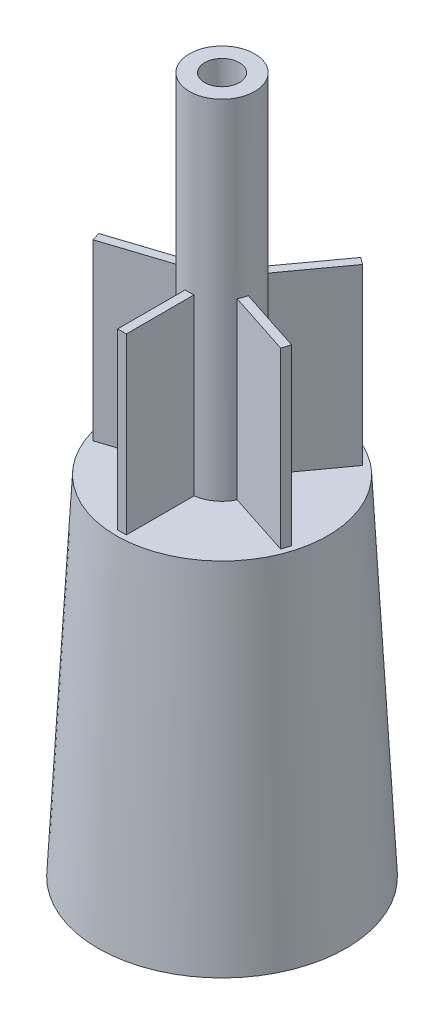
ISO-10303-21;
HEADER;
FILE_DESCRIPTION(('STEP AP214'),'2;1');
FILE_NAME('part.step','',(''),(''),'','','');
FILE_SCHEMA(('AUTOMOTIVE_DESIGN { 1 0 10303 214 1 1 1 1 }'));
ENDSEC;
DATA;
#1=APPLICATION_CONTEXT('core data for automotive mechanical design processes');
#2=APPLICATION_PROTOCOL_DEFINITION('international standard','automotive_design',2000,#1);
#3=PRODUCT_CONTEXT('',#1,'mechanical');
#4=PRODUCT('Part','Part','',(#3));
#5=PRODUCT_RELATED_PRODUCT_CATEGORY('part','',(#4));
#6=PRODUCT_DEFINITION_FORMATION('','',#4);
#7=PRODUCT_DEFINITION_CONTEXT('part definition',#1,'design');
#8=PRODUCT_DEFINITION('design','',#6,#7);
#9=PRODUCT_DEFINITION_SHAPE('','',#8);
#10=(LENGTH_UNIT() NAMED_UNIT(*) SI_UNIT(.MILLI.,.METRE.));
#11=(NAMED_UNIT(*) PLANE_ANGLE_UNIT() SI_UNIT($,.RADIAN.));
#12=(NAMED_UNIT(*) SI_UNIT($,.STERADIAN.) SOLID_ANGLE_UNIT());
#13=UNCERTAINTY_MEASURE_WITH_UNIT(LENGTH_MEASURE(1.E-05),#10,'distance_accuracy_value','');
#14=(GEOMETRIC_REPRESENTATION_CONTEXT(3) GLOBAL_UNCERTAINTY_ASSIGNED_CONTEXT((#13)) GLOBAL_UNIT_ASSIGNED_CONTEXT((#10,
#11,#12)) REPRESENTATION_CONTEXT('',''));
#15=CARTESIAN_POINT('',(0.,0.,0.));
#16=DIRECTION('',(0.,0.,1.));
#17=DIRECTION('',(1.,0.,0.));
#18=AXIS2_PLACEMENT_3D('',#15,#16,#17);
#19=CARTESIAN_POINT('',(0.,8.,0.));
#20=DIRECTION('',(0.,1.,0.));
#21=DIRECTION('',(0.,0.,1.));
#22=AXIS2_PLACEMENT_3D('',#19,#20,#21);
#23=PLANE('',#22);
#24=CARTESIAN_POINT('',(0.,8.,0.));
#25=DIRECTION('',(0.,1.,0.));
#26=DIRECTION('',(0.,0.,1.));
#27=AXIS2_PLACEMENT_3D('',#24,#25,#26);
#28=CIRCLE('',#27,2.43073776573567);
#29=CARTESIAN_POINT('',(0.,8.,2.43073776573567));
#30=VERTEX_POINT('',#29);
#31=EDGE_CURVE('E291',#30,#30,#28,.T.);
#32=ORIENTED_EDGE('',*,*,#31,.T.);
#33=EDGE_LOOP('',(#32));
#34=FACE_BOUND('',#33,.T.);
#35=CARTESIAN_POINT('',(0.,8.,0.));
#36=DIRECTION('',(0.,1.,0.));
#37=DIRECTION('',(0.,0.,1.));
#38=AXIS2_PLACEMENT_3D('',#35,#36,#37);
#39=CIRCLE('',#38,0.75);
#40=CARTESIAN_POINT('',(0.737397925678106,8.,0.13690982143596));
#41=VERTEX_POINT('',#40);
#42=CARTESIAN_POINT('',(0.518859513444568,8.,-0.541557758053623));
#43=VERTEX_POINT('',#42);
#44=EDGE_CURVE('E191',#41,#43,#39,.T.);
#45=ORIENTED_EDGE('',*,*,#44,.F.);
#46=DIRECTION('',(-0.951056516295151,0.,-0.309016994374954));
#47=VECTOR('',#46,1.);
#48=CARTESIAN_POINT('',(0.726953200234936,8.,0.133516124417729));
#49=LINE('',#48,#47);
#50=CARTESIAN_POINT('',(2.21599119974614,8.,0.617333898898175));
#51=VERTEX_POINT('',#50);
#52=EDGE_CURVE('E173',#51,#41,#49,.T.);
#53=ORIENTED_EDGE('',*,*,#52,.F.);
#54=DIRECTION('',(0.309016994374956,0.,-0.951056516295151));
#55=VECTOR('',#54,1.);
#56=CARTESIAN_POINT('',(2.21599119974614,8.,0.617333898898175));
#57=LINE('',#56,#55);
#58=CARTESIAN_POINT('',(2.15418780087115,8.,0.807545202157205));
#59=VERTEX_POINT('',#58);
#60=EDGE_CURVE('E182',#59,#51,#57,.T.);
#61=ORIENTED_EDGE('',*,*,#60,.F.);
#62=DIRECTION('',(0.951056516295151,0.,0.309016994374954));
#63=VECTOR('',#62,1.);
#64=CARTESIAN_POINT('',(0.664541881958577,8.,0.323529902689533));
#65=LINE('',#64,#63);
#66=CARTESIAN_POINT('',(0.674995593259396,8.,0.326926519389901));
#67=VERTEX_POINT('',#66);
#68=EDGE_CURVE('E192',#67,#59,#65,.T.);
#69=ORIENTED_EDGE('',*,*,#68,.F.);
#70=CARTESIAN_POINT('',(0.1,8.,0.743303437365925));
#71=VERTEX_POINT('',#70);
#72=EDGE_CURVE('E279',#71,#67,#39,.T.);
#73=ORIENTED_EDGE('',*,*,#72,.F.);
#74=DIRECTION('',(0.,0.,-1.));
#75=VECTOR('',#74,1.);
#76=CARTESIAN_POINT('',(0.1,8.,0.732316537305661));
#77=LINE('',#76,#75);
#78=CARTESIAN_POINT('',(0.1,8.,2.3));
#79=VERTEX_POINT('',#78);
#80=EDGE_CURVE('E242',#79,#71,#77,.T.);
#81=ORIENTED_EDGE('',*,*,#80,.F.);
#82=DIRECTION('',(1.,0.,0.));
#83=VECTOR('',#82,1.);
#84=CARTESIAN_POINT('',(0.1,8.,2.3));
#85=LINE('',#84,#83);
#86=CARTESIAN_POINT('',(-0.1,8.,2.3));
#87=VERTEX_POINT('',#86);
#88=EDGE_CURVE('E240',#87,#79,#85,.T.);
#89=ORIENTED_EDGE('',*,*,#88,.F.);
#90=DIRECTION('',(0.,0.,1.));
#91=VECTOR('',#90,1.);
#92=CARTESIAN_POINT('',(-0.1,8.,0.732316537305661));
#93=LINE('',#92,#91);
#94=CARTESIAN_POINT('',(-0.1,8.,0.743303437365925));
#95=VERTEX_POINT('',#94);
#96=EDGE_CURVE('E238',#95,#87,#93,.T.);
#97=ORIENTED_EDGE('',*,*,#96,.F.);
#98=CARTESIAN_POINT('',(-0.674995593259361,8.,0.326926519389975));
#99=VERTEX_POINT('',#98);
#100=EDGE_CURVE('E275',#99,#95,#39,.T.);
#101=ORIENTED_EDGE('',*,*,#100,.F.);
#102=DIRECTION('',(0.951056516295152,0.,-0.309016994374952));
#103=VECTOR('',#102,1.);
#104=CARTESIAN_POINT('',(-0.664541881958541,8.,0.323529902689606));
#105=LINE('',#104,#103);
#106=CARTESIAN_POINT('',(-2.15418780087127,8.,0.807545202157327));
#107=VERTEX_POINT('',#106);
#108=EDGE_CURVE('E260',#107,#99,#105,.T.);
#109=ORIENTED_EDGE('',*,*,#108,.F.);
#110=DIRECTION('',(0.309016994374943,0.,0.951056516295155));
#111=VECTOR('',#110,1.);
#112=CARTESIAN_POINT('',(-2.15418780087127,8.,0.807545202157327));
#113=LINE('',#112,#111);
#114=CARTESIAN_POINT('',(-2.21599119974626,8.,0.617333898898296));
#115=VERTEX_POINT('',#114);
#116=EDGE_CURVE('E258',#115,#107,#113,.T.);
#117=ORIENTED_EDGE('',*,*,#116,.F.);
#118=DIRECTION('',(-0.951056516295152,0.,0.309016994374952));
#119=VECTOR('',#118,1.);
#120=CARTESIAN_POINT('',(-0.726953200234921,8.,0.133516124417809));
#121=LINE('',#120,#119);
#122=CARTESIAN_POINT('',(-0.737397925678091,8.,0.13690982143604));
#123=VERTEX_POINT('',#122);
#124=EDGE_CURVE('E256',#123,#115,#121,.T.);
#125=ORIENTED_EDGE('',*,*,#124,.F.);
#126=CARTESIAN_POINT('',(-0.518859513444723,8.,-0.541557758053474));
#127=VERTEX_POINT('',#126);
#128=EDGE_CURVE('E274',#127,#123,#39,.T.);
#129=ORIENTED_EDGE('',*,*,#128,.F.);
#130=DIRECTION('',(0.587785252292486,0.,0.809016994374938));
#131=VECTOR('',#130,1.);
#132=CARTESIAN_POINT('',(-0.512399846395296,8.,-0.532666789114379));
#133=LINE('',#132,#131);
#134=CARTESIAN_POINT('',(-1.43136127908893,8.,-1.79750869068415));
#135=VERTEX_POINT('',#134);
#136=EDGE_CURVE('E222',#135,#127,#133,.T.);
#137=ORIENTED_EDGE('',*,*,#136,.F.);
#138=DIRECTION('',(-0.809016994374951,0.,0.587785252292468));
#139=VECTOR('',#138,1.);
#140=CARTESIAN_POINT('',(-1.43136127908893,8.,-1.79750869068415));
#141=LINE('',#140,#139);
#142=CARTESIAN_POINT('',(-1.26955788021394,8.,-1.91506574114264));
#143=VERTEX_POINT('',#142);
#144=EDGE_CURVE('E219',#143,#135,#141,.T.);
#145=ORIENTED_EDGE('',*,*,#144,.F.);
#146=DIRECTION('',(-0.587785252292486,0.,-0.809016994374938));
#147=VECTOR('',#146,1.);
#148=CARTESIAN_POINT('',(-0.35082865132262,8.,-0.650543440688243));
#149=LINE('',#148,#147);
#150=CARTESIAN_POINT('',(-0.357284886112847,8.,-0.659429685527828));
#151=VERTEX_POINT('',#150);
#152=EDGE_CURVE('E224',#151,#143,#149,.T.);
#153=ORIENTED_EDGE('',*,*,#152,.F.);
#154=CARTESIAN_POINT('',(0.357284886112658,8.,-0.65942968552793));
#155=VERTEX_POINT('',#154);
#156=EDGE_CURVE('E340',#155,#151,#39,.T.);
#157=ORIENTED_EDGE('',*,*,#156,.F.);
#158=DIRECTION('',(-0.587785252292463,0.,0.809016994374954));
#159=VECTOR('',#158,1.);
#160=CARTESIAN_POINT('',(0.350828651322431,8.,-0.650543440688344));
#161=LINE('',#160,#159);
#162=CARTESIAN_POINT('',(1.26955788021368,8.,-1.91506574114272));
#163=VERTEX_POINT('',#162);
#164=EDGE_CURVE('E205',#163,#155,#161,.T.);
#165=ORIENTED_EDGE('',*,*,#164,.F.);
#166=DIRECTION('',(-0.809016994374942,0.,-0.587785252292481));
#167=VECTOR('',#166,1.);
#168=CARTESIAN_POINT('',(1.26955788021368,8.,-1.91506574114272));
#169=LINE('',#168,#167);
#170=CARTESIAN_POINT('',(1.43136127908867,8.,-1.79750869068422));
#171=VERTEX_POINT('',#170);
#172=EDGE_CURVE('E177',#171,#163,#169,.T.);
#173=ORIENTED_EDGE('',*,*,#172,.F.);
#174=DIRECTION('',(0.587785252292464,0.,-0.809016994374954));
#175=VECTOR('',#174,1.);
#176=CARTESIAN_POINT('',(0.512399846395141,8.,-0.532666789114528));
#177=LINE('',#176,#175);
#178=EDGE_CURVE('E207',#43,#171,#177,.T.);
#179=ORIENTED_EDGE('',*,*,#178,.F.);
#180=EDGE_LOOP('',(#45,#53,#61,#69,#73,#81,#89,#97,#101,#109,#117,#125,#129,#137,#145,#153,#157,
#165,#173,#179));
#181=FACE_BOUND('',#180,.T.);
#182=ADVANCED_FACE('F34',(#34,#181),#23,.T.);
#183=CARTESIAN_POINT('',(0.,16.,0.));
#184=DIRECTION('',(0.,-1.,0.));
#185=DIRECTION('',(0.,0.,-1.));
#186=AXIS2_PLACEMENT_3D('',#183,#184,#185);
#187=CYLINDRICAL_SURFACE('',#186,0.75);
#188=CARTESIAN_POINT('',(0.,16.,0.));
#189=DIRECTION('',(0.,1.,0.));
#190=DIRECTION('',(0.,0.,1.));
#191=AXIS2_PLACEMENT_3D('',#188,#189,#190);
#192=CIRCLE('',#191,0.75);
#193=CARTESIAN_POINT('',(0.,16.,0.75));
#194=VERTEX_POINT('',#193);
#195=EDGE_CURVE('E278',#194,#194,#192,.T.);
#196=ORIENTED_EDGE('',*,*,#195,.F.);
#197=EDGE_LOOP('',(#196));
#198=FACE_BOUND('',#197,.T.);
#199=DIRECTION('',(0.,-1.,0.));
#200=VECTOR('',#199,1.);
#201=CARTESIAN_POINT('',(0.737397925678106,16.,0.13690982143596));
#202=LINE('',#201,#200);
#203=CARTESIAN_POINT('',(0.737397925678106,12.,0.13690982143596));
#204=VERTEX_POINT('',#203);
#205=EDGE_CURVE('E11',#41,#204,#202,.F.);
#206=ORIENTED_EDGE('',*,*,#205,.F.);
#207=ORIENTED_EDGE('',*,*,#44,.T.);
#208=DIRECTION('',(0.,-1.,0.));
#209=VECTOR('',#208,1.);
#210=CARTESIAN_POINT('',(0.518859513444568,16.,-0.541557758053623));
#211=LINE('',#210,#209);
#212=CARTESIAN_POINT('',(0.518859513444568,12.,-0.541557758053623));
#213=VERTEX_POINT('',#212);
#214=EDGE_CURVE('E323',#213,#43,#211,.T.);
#215=ORIENTED_EDGE('',*,*,#214,.F.);
#216=CARTESIAN_POINT('',(0.,12.,0.));
#217=DIRECTION('',(0.,1.,0.));
#218=DIRECTION('',(0.,0.,1.));
#219=AXIS2_PLACEMENT_3D('',#216,#217,#218);
#220=CIRCLE('',#219,0.75);
#221=CARTESIAN_POINT('',(0.357284886112658,12.,-0.65942968552793));
#222=VERTEX_POINT('',#221);
#223=EDGE_CURVE('E320',#213,#222,#220,.T.);
#224=ORIENTED_EDGE('',*,*,#223,.T.);
#225=DIRECTION('',(0.,-1.,0.));
#226=VECTOR('',#225,1.);
#227=CARTESIAN_POINT('',(0.357284886112658,16.,-0.65942968552793));
#228=LINE('',#227,#226);
#229=EDGE_CURVE('E326',#155,#222,#228,.F.);
#230=ORIENTED_EDGE('',*,*,#229,.F.);
#231=ORIENTED_EDGE('',*,*,#156,.T.);
#232=DIRECTION('',(0.,-1.,0.));
#233=VECTOR('',#232,1.);
#234=CARTESIAN_POINT('',(-0.357284886112847,16.,-0.659429685527828));
#235=LINE('',#234,#233);
#236=CARTESIAN_POINT('',(-0.357284886112847,12.,-0.659429685527828));
#237=VERTEX_POINT('',#236);
#238=EDGE_CURVE('E314',#237,#151,#235,.T.);
#239=ORIENTED_EDGE('',*,*,#238,.F.);
#240=CARTESIAN_POINT('',(0.,12.,0.));
#241=DIRECTION('',(0.,1.,0.));
#242=DIRECTION('',(0.,0.,1.));
#243=AXIS2_PLACEMENT_3D('',#240,#241,#242);
#244=CIRCLE('',#243,0.75);
#245=CARTESIAN_POINT('',(-0.518859513444723,12.,-0.541557758053474));
#246=VERTEX_POINT('',#245);
#247=EDGE_CURVE('E311',#237,#246,#244,.T.);
#248=ORIENTED_EDGE('',*,*,#247,.T.);
#249=DIRECTION('',(0.,-1.,0.));
#250=VECTOR('',#249,1.);
#251=CARTESIAN_POINT('',(-0.518859513444723,16.,-0.541557758053474));
#252=LINE('',#251,#250);
#253=EDGE_CURVE('E317',#127,#246,#252,.F.);
#254=ORIENTED_EDGE('',*,*,#253,.F.);
#255=ORIENTED_EDGE('',*,*,#128,.T.);
#256=DIRECTION('',(0.,-1.,0.));
#257=VECTOR('',#256,1.);
#258=CARTESIAN_POINT('',(-0.737397925678091,16.,0.13690982143604));
#259=LINE('',#258,#257);
#260=CARTESIAN_POINT('',(-0.737397925678091,12.,0.13690982143604));
#261=VERTEX_POINT('',#260);
#262=EDGE_CURVE('E300',#261,#123,#259,.T.);
#263=ORIENTED_EDGE('',*,*,#262,.F.);
#264=CARTESIAN_POINT('',(0.,12.,0.));
#265=DIRECTION('',(0.,1.,0.));
#266=DIRECTION('',(0.,0.,1.));
#267=AXIS2_PLACEMENT_3D('',#264,#265,#266);
#268=CIRCLE('',#267,0.75);
#269=CARTESIAN_POINT('',(-0.674995593259361,12.,0.326926519389975));
#270=VERTEX_POINT('',#269);
#271=EDGE_CURVE('E294',#261,#270,#268,.T.);
#272=ORIENTED_EDGE('',*,*,#271,.T.);
#273=DIRECTION('',(0.,-1.,0.));
#274=VECTOR('',#273,1.);
#275=CARTESIAN_POINT('',(-0.674995593259361,16.,0.326926519389975));
#276=LINE('',#275,#274);
#277=EDGE_CURVE('E297',#99,#270,#276,.F.);
#278=ORIENTED_EDGE('',*,*,#277,.F.);
#279=ORIENTED_EDGE('',*,*,#100,.T.);
#280=DIRECTION('',(0.,-1.,0.));
#281=VECTOR('',#280,1.);
#282=CARTESIAN_POINT('',(-0.1,16.,0.743303437365925));
#283=LINE('',#282,#281);
#284=CARTESIAN_POINT('',(-0.1,12.,0.743303437365925));
#285=VERTEX_POINT('',#284);
#286=EDGE_CURVE('E309',#285,#95,#283,.T.);
#287=ORIENTED_EDGE('',*,*,#286,.F.);
#288=CARTESIAN_POINT('',(0.,12.,0.));
#289=DIRECTION('',(0.,1.,0.));
#290=DIRECTION('',(0.,0.,1.));
#291=AXIS2_PLACEMENT_3D('',#288,#289,#290);
#292=CIRCLE('',#291,0.75);
#293=CARTESIAN_POINT('',(0.1,12.,0.743303437365925));
#294=VERTEX_POINT('',#293);
#295=EDGE_CURVE('E303',#285,#294,#292,.T.);
#296=ORIENTED_EDGE('',*,*,#295,.T.);
#297=DIRECTION('',(0.,-1.,0.));
#298=VECTOR('',#297,1.);
#299=CARTESIAN_POINT('',(0.1,16.,0.743303437365925));
#300=LINE('',#299,#298);
#301=EDGE_CURVE('E306',#71,#294,#300,.F.);
#302=ORIENTED_EDGE('',*,*,#301,.F.);
#303=ORIENTED_EDGE('',*,*,#72,.T.);
#304=DIRECTION('',(0.,-1.,0.));
#305=VECTOR('',#304,1.);
#306=CARTESIAN_POINT('',(0.674995593259396,16.,0.326926519389901));
#307=LINE('',#306,#305);
#308=CARTESIAN_POINT('',(0.674995593259396,12.,0.326926519389901));
#309=VERTEX_POINT('',#308);
#310=EDGE_CURVE('E42',#309,#67,#307,.T.);
#311=ORIENTED_EDGE('',*,*,#310,.F.);
#312=CARTESIAN_POINT('',(0.,12.,0.));
#313=DIRECTION('',(0.,1.,0.));
#314=DIRECTION('',(0.,0.,1.));
#315=AXIS2_PLACEMENT_3D('',#312,#313,#314);
#316=CIRCLE('',#315,0.75);
#317=EDGE_CURVE('E328',#309,#204,#316,.T.);
#318=ORIENTED_EDGE('',*,*,#317,.T.);
#319=EDGE_LOOP('',(#206,#207,#215,#224,#230,#231,#239,#248,#254,#255,#263,#272,#278,#279,#287,
#296,#302,#303,#311,#318));
#320=FACE_BOUND('',#319,.T.);
#321=ADVANCED_FACE('F339',(#198,#320),#187,.T.);
#322=CARTESIAN_POINT('',(0.,0.,0.));
#323=DIRECTION('',(0.,-1.,0.));
#324=DIRECTION('',(0.,0.,1.));
#325=AXIS2_PLACEMENT_3D('',#322,#323,#324);
#326=CONICAL_SURFACE('',#325,2.85,0.05235987755983);
#327=ORIENTED_EDGE('',*,*,#31,.F.);
#328=EDGE_LOOP('',(#327));
#329=FACE_BOUND('',#328,.T.);
#330=CARTESIAN_POINT('',(0.,0.,0.));
#331=DIRECTION('',(0.,1.,0.));
#332=DIRECTION('',(0.,0.,1.));
#333=AXIS2_PLACEMENT_3D('',#330,#331,#332);
#334=CIRCLE('',#333,2.85);
#335=CARTESIAN_POINT('',(0.,0.,2.85));
#336=VERTEX_POINT('',#335);
#337=EDGE_CURVE('E286',#336,#336,#334,.T.);
#338=ORIENTED_EDGE('',*,*,#337,.T.);
#339=EDGE_LOOP('',(#338));
#340=FACE_BOUND('',#339,.T.);
#341=ADVANCED_FACE('F36',(#329,#340),#326,.T.);
#342=CARTESIAN_POINT('',(0.,0.,0.));
#343=DIRECTION('',(0.,1.,0.));
#344=DIRECTION('',(0.,0.,1.));
#345=AXIS2_PLACEMENT_3D('',#342,#343,#344);
#346=PLANE('',#345);
#347=CARTESIAN_POINT('',(0.,0.,0.));
#348=DIRECTION('',(0.,1.,0.));
#349=DIRECTION('',(0.,0.,1.));
#350=AXIS2_PLACEMENT_3D('',#347,#348,#349);
#351=CIRCLE('',#350,2.34931382700104);
#352=CARTESIAN_POINT('',(0.,0.,2.34931382700104));
#353=VERTEX_POINT('',#352);
#354=EDGE_CURVE('E282',#353,#353,#351,.T.);
#355=ORIENTED_EDGE('',*,*,#354,.T.);
#356=EDGE_LOOP('',(#355));
#357=FACE_BOUND('',#356,.T.);
#358=ORIENTED_EDGE('',*,*,#337,.F.);
#359=EDGE_LOOP('',(#358));
#360=FACE_BOUND('',#359,.T.);
#361=ADVANCED_FACE('F412',(#357,#360),#346,.F.);
#362=CARTESIAN_POINT('',(0.,-0.026167978121472,0.));
#363=DIRECTION('',(0.,-1.,0.));
#364=DIRECTION('',(0.,0.,1.));
#365=AXIS2_PLACEMENT_3D('',#362,#363,#364);
#366=CONICAL_SURFACE('',#365,2.35068523262271,0.05235987755983);
#367=CARTESIAN_POINT('',(0.,7.5,0.));
#368=DIRECTION('',(0.,1.,0.));
#369=DIRECTION('',(0.,0.,1.));
#370=AXIS2_PLACEMENT_3D('',#367,#368,#369);
#371=CIRCLE('',#370,1.95625548237823);
#372=CARTESIAN_POINT('',(0.,7.5,1.95625548237823));
#373=VERTEX_POINT('',#372);
#374=EDGE_CURVE('E283',#373,#373,#371,.T.);
#375=ORIENTED_EDGE('',*,*,#374,.T.);
#376=EDGE_LOOP('',(#375));
#377=FACE_BOUND('',#376,.T.);
#378=ORIENTED_EDGE('',*,*,#354,.F.);
#379=EDGE_LOOP('',(#378));
#380=FACE_BOUND('',#379,.T.);
#381=ADVANCED_FACE('F415',(#377,#380),#366,.F.);
#382=CARTESIAN_POINT('',(0.,7.5,0.));
#383=DIRECTION('',(0.,1.,0.));
#384=DIRECTION('',(0.,0.,1.));
#385=AXIS2_PLACEMENT_3D('',#382,#383,#384);
#386=PLANE('',#385);
#387=CARTESIAN_POINT('',(0.,7.5,0.));
#388=DIRECTION('',(0.,-1.,0.));
#389=DIRECTION('',(0.,0.,-1.));
#390=AXIS2_PLACEMENT_3D('',#387,#388,#389);
#391=CIRCLE('',#390,0.398521603702742);
#392=CARTESIAN_POINT('',(0.,7.5,-0.398521603702742));
#393=VERTEX_POINT('',#392);
#394=EDGE_CURVE('E489',#393,#393,#391,.T.);
#395=ORIENTED_EDGE('',*,*,#394,.F.);
#396=EDGE_LOOP('',(#395));
#397=FACE_BOUND('',#396,.T.);
#398=ORIENTED_EDGE('',*,*,#374,.F.);
#399=EDGE_LOOP('',(#398));
#400=FACE_BOUND('',#399,.T.);
#401=ADVANCED_FACE('F417',(#397,#400),#386,.F.);
#402=CARTESIAN_POINT('',(0.,16.,0.));
#403=DIRECTION('',(0.,1.,0.));
#404=DIRECTION('',(0.,0.,1.));
#405=AXIS2_PLACEMENT_3D('',#402,#403,#404);
#406=PLANE('',#405);
#407=CARTESIAN_POINT('',(0.,16.,0.));
#408=DIRECTION('',(0.,-1.,0.));
#409=DIRECTION('',(0.,0.,-1.));
#410=AXIS2_PLACEMENT_3D('',#407,#408,#409);
#411=CIRCLE('',#410,0.398521603702742);
#412=CARTESIAN_POINT('',(0.,16.,-0.398521603702742));
#413=VERTEX_POINT('',#412);
#414=EDGE_CURVE('E187',#413,#413,#411,.T.);
#415=ORIENTED_EDGE('',*,*,#414,.T.);
#416=EDGE_LOOP('',(#415));
#417=FACE_BOUND('',#416,.T.);
#418=ORIENTED_EDGE('',*,*,#195,.T.);
#419=EDGE_LOOP('',(#418));
#420=FACE_BOUND('',#419,.T.);
#421=ADVANCED_FACE('F420',(#417,#420),#406,.T.);
#422=CARTESIAN_POINT('',(-0.726953200234921,12.,0.133516124417809));
#423=DIRECTION('',(0.309016994374952,0.,0.951056516295152));
#424=DIRECTION('',(0.951056516295152,0.,-0.309016994374952));
#425=AXIS2_PLACEMENT_3D('',#422,#423,#424);
#426=PLANE('',#425);
#427=DIRECTION('',(-0.951056516295152,0.,0.309016994374952));
#428=VECTOR('',#427,1.);
#429=CARTESIAN_POINT('',(-0.726953200234921,12.,0.133516124417809));
#430=LINE('',#429,#428);
#431=CARTESIAN_POINT('',(-2.21599119974626,12.,0.617333898898296));
#432=VERTEX_POINT('',#431);
#433=EDGE_CURVE('E262',#261,#432,#430,.T.);
#434=ORIENTED_EDGE('',*,*,#433,.F.);
#435=ORIENTED_EDGE('',*,*,#262,.T.);
#436=ORIENTED_EDGE('',*,*,#124,.T.);
#437=DIRECTION('',(0.,-1.,0.));
#438=VECTOR('',#437,1.);
#439=CARTESIAN_POINT('',(-2.21599119974626,12.,0.617333898898296));
#440=LINE('',#439,#438);
#441=EDGE_CURVE('E271',#432,#115,#440,.T.);
#442=ORIENTED_EDGE('',*,*,#441,.F.);
#443=EDGE_LOOP('',(#434,#435,#436,#442));
#444=FACE_BOUND('',#443,.T.);
#445=ADVANCED_FACE('F368',(#444),#426,.F.);
#446=CARTESIAN_POINT('',(-0.664541881958541,12.,0.323529902689606));
#447=DIRECTION('',(-0.309016994374952,0.,-0.951056516295152));
#448=DIRECTION('',(-0.951056516295152,0.,0.309016994374952));
#449=AXIS2_PLACEMENT_3D('',#446,#447,#448);
#450=PLANE('',#449);
#451=ORIENTED_EDGE('',*,*,#108,.T.);
#452=ORIENTED_EDGE('',*,*,#277,.T.);
#453=DIRECTION('',(0.951056516295152,0.,-0.309016994374952));
#454=VECTOR('',#453,1.);
#455=CARTESIAN_POINT('',(-0.664541881958541,12.,0.323529902689606));
#456=LINE('',#455,#454);
#457=CARTESIAN_POINT('',(-2.15418780087127,12.,0.807545202157327));
#458=VERTEX_POINT('',#457);
#459=EDGE_CURVE('E266',#458,#270,#456,.T.);
#460=ORIENTED_EDGE('',*,*,#459,.F.);
#461=DIRECTION('',(0.,-1.,0.));
#462=VECTOR('',#461,1.);
#463=CARTESIAN_POINT('',(-2.15418780087127,12.,0.807545202157327));
#464=LINE('',#463,#462);
#465=EDGE_CURVE('E268',#458,#107,#464,.T.);
#466=ORIENTED_EDGE('',*,*,#465,.T.);
#467=EDGE_LOOP('',(#451,#452,#460,#466));
#468=FACE_BOUND('',#467,.T.);
#469=ADVANCED_FACE('F430',(#468),#450,.F.);
#470=CARTESIAN_POINT('',(0.,12.,0.));
#471=DIRECTION('',(0.,1.,0.));
#472=DIRECTION('',(0.,0.,1.));
#473=AXIS2_PLACEMENT_3D('',#470,#471,#472);
#474=PLANE('',#473);
#475=ORIENTED_EDGE('',*,*,#271,.F.);
#476=ORIENTED_EDGE('',*,*,#433,.T.);
#477=DIRECTION('',(0.309016994374943,0.,0.951056516295155));
#478=VECTOR('',#477,1.);
#479=CARTESIAN_POINT('',(-2.15418780087127,12.,0.807545202157327));
#480=LINE('',#479,#478);
#481=EDGE_CURVE('E264',#432,#458,#480,.T.);
#482=ORIENTED_EDGE('',*,*,#481,.T.);
#483=ORIENTED_EDGE('',*,*,#459,.T.);
#484=EDGE_LOOP('',(#475,#476,#482,#483));
#485=FACE_BOUND('',#484,.T.);
#486=ADVANCED_FACE('F375',(#485),#474,.T.);
#487=CARTESIAN_POINT('',(-2.15418780087127,12.,0.807545202157327));
#488=DIRECTION('',(0.951056516295155,0.,-0.309016994374943));
#489=DIRECTION('',(-0.309016994374943,0.,-0.951056516295155));
#490=AXIS2_PLACEMENT_3D('',#487,#488,#489);
#491=PLANE('',#490);
#492=ORIENTED_EDGE('',*,*,#116,.T.);
#493=ORIENTED_EDGE('',*,*,#465,.F.);
#494=ORIENTED_EDGE('',*,*,#481,.F.);
#495=ORIENTED_EDGE('',*,*,#441,.T.);
#496=EDGE_LOOP('',(#492,#493,#494,#495));
#497=FACE_BOUND('',#496,.T.);
#498=ADVANCED_FACE('F371',(#497),#491,.F.);
#499=CARTESIAN_POINT('',(-0.1,12.,0.732316537305661));
#500=DIRECTION('',(1.,0.,0.));
#501=DIRECTION('',(0.,0.,-1.));
#502=AXIS2_PLACEMENT_3D('',#499,#500,#501);
#503=PLANE('',#502);
#504=DIRECTION('',(0.,0.,1.));
#505=VECTOR('',#504,1.);
#506=CARTESIAN_POINT('',(-0.1,12.,0.732316537305661));
#507=LINE('',#506,#505);
#508=CARTESIAN_POINT('',(-0.1,12.,2.3));
#509=VERTEX_POINT('',#508);
#510=EDGE_CURVE('E244',#285,#509,#507,.T.);
#511=ORIENTED_EDGE('',*,*,#510,.F.);
#512=ORIENTED_EDGE('',*,*,#286,.T.);
#513=ORIENTED_EDGE('',*,*,#96,.T.);
#514=DIRECTION('',(0.,-1.,0.));
#515=VECTOR('',#514,1.);
#516=CARTESIAN_POINT('',(-0.1,12.,2.3));
#517=LINE('',#516,#515);
#518=EDGE_CURVE('E253',#509,#87,#517,.T.);
#519=ORIENTED_EDGE('',*,*,#518,.F.);
#520=EDGE_LOOP('',(#511,#512,#513,#519));
#521=FACE_BOUND('',#520,.T.);
#522=ADVANCED_FACE('F385',(#521),#503,.F.);
#523=CARTESIAN_POINT('',(0.1,12.,0.732316537305661));
#524=DIRECTION('',(-1.,0.,0.));
#525=DIRECTION('',(0.,0.,1.));
#526=AXIS2_PLACEMENT_3D('',#523,#524,#525);
#527=PLANE('',#526);
#528=ORIENTED_EDGE('',*,*,#80,.T.);
#529=ORIENTED_EDGE('',*,*,#301,.T.);
#530=DIRECTION('',(0.,0.,-1.));
#531=VECTOR('',#530,1.);
#532=CARTESIAN_POINT('',(0.1,12.,0.732316537305661));
#533=LINE('',#532,#531);
#534=CARTESIAN_POINT('',(0.1,12.,2.3));
#535=VERTEX_POINT('',#534);
#536=EDGE_CURVE('E248',#535,#294,#533,.T.);
#537=ORIENTED_EDGE('',*,*,#536,.F.);
#538=DIRECTION('',(0.,-1.,0.));
#539=VECTOR('',#538,1.);
#540=CARTESIAN_POINT('',(0.1,12.,2.3));
#541=LINE('',#540,#539);
#542=EDGE_CURVE('E250',#535,#79,#541,.T.);
#543=ORIENTED_EDGE('',*,*,#542,.T.);
#544=EDGE_LOOP('',(#528,#529,#537,#543));
#545=FACE_BOUND('',#544,.T.);
#546=ADVANCED_FACE('F394',(#545),#527,.F.);
#547=CARTESIAN_POINT('',(0.,12.,0.));
#548=DIRECTION('',(0.,1.,0.));
#549=DIRECTION('',(0.,0.,1.));
#550=AXIS2_PLACEMENT_3D('',#547,#548,#549);
#551=PLANE('',#550);
#552=ORIENTED_EDGE('',*,*,#295,.F.);
#553=ORIENTED_EDGE('',*,*,#510,.T.);
#554=DIRECTION('',(1.,0.,0.));
#555=VECTOR('',#554,1.);
#556=CARTESIAN_POINT('',(0.1,12.,2.3));
#557=LINE('',#556,#555);
#558=EDGE_CURVE('E246',#509,#535,#557,.T.);
#559=ORIENTED_EDGE('',*,*,#558,.T.);
#560=ORIENTED_EDGE('',*,*,#536,.T.);
#561=EDGE_LOOP('',(#552,#553,#559,#560));
#562=FACE_BOUND('',#561,.T.);
#563=ADVANCED_FACE('F392',(#562),#551,.T.);
#564=CARTESIAN_POINT('',(0.1,12.,2.3));
#565=DIRECTION('',(0.,0.,-1.));
#566=DIRECTION('',(-1.,0.,0.));
#567=AXIS2_PLACEMENT_3D('',#564,#565,#566);
#568=PLANE('',#567);
#569=ORIENTED_EDGE('',*,*,#88,.T.);
#570=ORIENTED_EDGE('',*,*,#542,.F.);
#571=ORIENTED_EDGE('',*,*,#558,.F.);
#572=ORIENTED_EDGE('',*,*,#518,.T.);
#573=EDGE_LOOP('',(#569,#570,#571,#572));
#574=FACE_BOUND('',#573,.T.);
#575=ADVANCED_FACE('F388',(#574),#568,.F.);
#576=CARTESIAN_POINT('',(-0.512399846395296,12.,-0.532666789114379));
#577=DIRECTION('',(0.809016994374938,0.,-0.587785252292486));
#578=DIRECTION('',(-0.587785252292486,0.,-0.809016994374938));
#579=AXIS2_PLACEMENT_3D('',#576,#577,#578);
#580=PLANE('',#579);
#581=ORIENTED_EDGE('',*,*,#136,.T.);
#582=ORIENTED_EDGE('',*,*,#253,.T.);
#583=DIRECTION('',(0.587785252292486,0.,0.809016994374938));
#584=VECTOR('',#583,1.);
#585=CARTESIAN_POINT('',(-0.512399846395296,12.,-0.532666789114379));
#586=LINE('',#585,#584);
#587=CARTESIAN_POINT('',(-1.43136127908893,12.,-1.79750869068415));
#588=VERTEX_POINT('',#587);
#589=EDGE_CURVE('E229',#588,#246,#586,.T.);
#590=ORIENTED_EDGE('',*,*,#589,.F.);
#591=DIRECTION('',(0.,-1.,0.));
#592=VECTOR('',#591,1.);
#593=CARTESIAN_POINT('',(-1.43136127908893,12.,-1.79750869068415));
#594=LINE('',#593,#592);
#595=EDGE_CURVE('E236',#588,#135,#594,.T.);
#596=ORIENTED_EDGE('',*,*,#595,.T.);
#597=EDGE_LOOP('',(#581,#582,#590,#596));
#598=FACE_BOUND('',#597,.T.);
#599=ADVANCED_FACE('F437',(#598),#580,.F.);
#600=CARTESIAN_POINT('',(-0.35082865132262,12.,-0.650543440688243));
#601=DIRECTION('',(-0.809016994374938,0.,0.587785252292486));
#602=DIRECTION('',(0.587785252292486,0.,0.809016994374938));
#603=AXIS2_PLACEMENT_3D('',#600,#601,#602);
#604=PLANE('',#603);
#605=DIRECTION('',(-0.587785252292486,0.,-0.809016994374938));
#606=VECTOR('',#605,1.);
#607=CARTESIAN_POINT('',(-0.35082865132262,12.,-0.650543440688243));
#608=LINE('',#607,#606);
#609=CARTESIAN_POINT('',(-1.26955788021394,12.,-1.91506574114264));
#610=VERTEX_POINT('',#609);
#611=EDGE_CURVE('E231',#237,#610,#608,.T.);
#612=ORIENTED_EDGE('',*,*,#611,.F.);
#613=ORIENTED_EDGE('',*,*,#238,.T.);
#614=ORIENTED_EDGE('',*,*,#152,.T.);
#615=DIRECTION('',(0.,-1.,0.));
#616=VECTOR('',#615,1.);
#617=CARTESIAN_POINT('',(-1.26955788021394,12.,-1.91506574114264));
#618=LINE('',#617,#616);
#619=EDGE_CURVE('E233',#610,#143,#618,.T.);
#620=ORIENTED_EDGE('',*,*,#619,.F.);
#621=EDGE_LOOP('',(#612,#613,#614,#620));
#622=FACE_BOUND('',#621,.T.);
#623=ADVANCED_FACE('F351',(#622),#604,.F.);
#624=CARTESIAN_POINT('',(0.,12.,0.));
#625=DIRECTION('',(0.,1.,0.));
#626=DIRECTION('',(0.,0.,1.));
#627=AXIS2_PLACEMENT_3D('',#624,#625,#626);
#628=PLANE('',#627);
#629=ORIENTED_EDGE('',*,*,#247,.F.);
#630=ORIENTED_EDGE('',*,*,#611,.T.);
#631=DIRECTION('',(-0.809016994374951,0.,0.587785252292468));
#632=VECTOR('',#631,1.);
#633=CARTESIAN_POINT('',(-1.43136127908893,12.,-1.79750869068415));
#634=LINE('',#633,#632);
#635=EDGE_CURVE('E226',#610,#588,#634,.T.);
#636=ORIENTED_EDGE('',*,*,#635,.T.);
#637=ORIENTED_EDGE('',*,*,#589,.T.);
#638=EDGE_LOOP('',(#629,#630,#636,#637));
#639=FACE_BOUND('',#638,.T.);
#640=ADVANCED_FACE('F360',(#639),#628,.T.);
#641=CARTESIAN_POINT('',(-1.43136127908893,12.,-1.79750869068415));
#642=DIRECTION('',(0.587785252292468,0.,0.809016994374951));
#643=DIRECTION('',(0.809016994374951,0.,-0.587785252292468));
#644=AXIS2_PLACEMENT_3D('',#641,#642,#643);
#645=PLANE('',#644);
#646=ORIENTED_EDGE('',*,*,#144,.T.);
#647=ORIENTED_EDGE('',*,*,#595,.F.);
#648=ORIENTED_EDGE('',*,*,#635,.F.);
#649=ORIENTED_EDGE('',*,*,#619,.T.);
#650=EDGE_LOOP('',(#646,#647,#648,#649));
#651=FACE_BOUND('',#650,.T.);
#652=ADVANCED_FACE('F357',(#651),#645,.F.);
#653=CARTESIAN_POINT('',(0.350828651322431,12.,-0.650543440688344));
#654=DIRECTION('',(0.809016994374954,0.,0.587785252292464));
#655=DIRECTION('',(0.587785252292464,0.,-0.809016994374954));
#656=AXIS2_PLACEMENT_3D('',#653,#654,#655);
#657=PLANE('',#656);
#658=ORIENTED_EDGE('',*,*,#164,.T.);
#659=ORIENTED_EDGE('',*,*,#229,.T.);
#660=DIRECTION('',(-0.587785252292463,0.,0.809016994374954));
#661=VECTOR('',#660,1.);
#662=CARTESIAN_POINT('',(0.350828651322431,12.,-0.650543440688344));
#663=LINE('',#662,#661);
#664=CARTESIAN_POINT('',(1.26955788021368,12.,-1.91506574114272));
#665=VERTEX_POINT('',#664);
#666=EDGE_CURVE('E56',#665,#222,#663,.T.);
#667=ORIENTED_EDGE('',*,*,#666,.F.);
#668=DIRECTION('',(0.,-1.,0.));
#669=VECTOR('',#668,1.);
#670=CARTESIAN_POINT('',(1.26955788021368,12.,-1.91506574114272));
#671=LINE('',#670,#669);
#672=EDGE_CURVE('E217',#665,#163,#671,.T.);
#673=ORIENTED_EDGE('',*,*,#672,.T.);
#674=EDGE_LOOP('',(#658,#659,#667,#673));
#675=FACE_BOUND('',#674,.T.);
#676=ADVANCED_FACE('F449',(#675),#657,.F.);
#677=CARTESIAN_POINT('',(0.512399846395141,12.,-0.532666789114528));
#678=DIRECTION('',(-0.809016994374954,0.,-0.587785252292464));
#679=DIRECTION('',(-0.587785252292464,0.,0.809016994374954));
#680=AXIS2_PLACEMENT_3D('',#677,#678,#679);
#681=PLANE('',#680);
#682=DIRECTION('',(0.587785252292464,0.,-0.809016994374954));
#683=VECTOR('',#682,1.);
#684=CARTESIAN_POINT('',(0.512399846395141,12.,-0.532666789114528));
#685=LINE('',#684,#683);
#686=CARTESIAN_POINT('',(1.43136127908867,12.,-1.79750869068422));
#687=VERTEX_POINT('',#686);
#688=EDGE_CURVE('E212',#213,#687,#685,.T.);
#689=ORIENTED_EDGE('',*,*,#688,.F.);
#690=ORIENTED_EDGE('',*,*,#214,.T.);
#691=ORIENTED_EDGE('',*,*,#178,.T.);
#692=DIRECTION('',(0.,-1.,0.));
#693=VECTOR('',#692,1.);
#694=CARTESIAN_POINT('',(1.43136127908867,12.,-1.79750869068422));
#695=LINE('',#694,#693);
#696=EDGE_CURVE('E214',#687,#171,#695,.T.);
#697=ORIENTED_EDGE('',*,*,#696,.F.);
#698=EDGE_LOOP('',(#689,#690,#691,#697));
#699=FACE_BOUND('',#698,.T.);
#700=ADVANCED_FACE('F454',(#699),#681,.F.);
#701=CARTESIAN_POINT('',(0.,12.,0.));
#702=DIRECTION('',(0.,1.,0.));
#703=DIRECTION('',(0.,0.,1.));
#704=AXIS2_PLACEMENT_3D('',#701,#702,#703);
#705=PLANE('',#704);
#706=ORIENTED_EDGE('',*,*,#223,.F.);
#707=ORIENTED_EDGE('',*,*,#688,.T.);
#708=DIRECTION('',(-0.809016994374942,0.,-0.587785252292481));
#709=VECTOR('',#708,1.);
#710=CARTESIAN_POINT('',(1.26955788021368,12.,-1.91506574114272));
#711=LINE('',#710,#709);
#712=EDGE_CURVE('E209',#687,#665,#711,.T.);
#713=ORIENTED_EDGE('',*,*,#712,.T.);
#714=ORIENTED_EDGE('',*,*,#666,.T.);
#715=EDGE_LOOP('',(#706,#707,#713,#714));
#716=FACE_BOUND('',#715,.T.);
#717=ADVANCED_FACE('F462',(#716),#705,.T.);
#718=CARTESIAN_POINT('',(1.26955788021368,12.,-1.91506574114272));
#719=DIRECTION('',(-0.587785252292481,0.,0.809016994374942));
#720=DIRECTION('',(0.809016994374942,0.,0.587785252292481));
#721=AXIS2_PLACEMENT_3D('',#718,#719,#720);
#722=PLANE('',#721);
#723=ORIENTED_EDGE('',*,*,#172,.T.);
#724=ORIENTED_EDGE('',*,*,#672,.F.);
#725=ORIENTED_EDGE('',*,*,#712,.F.);
#726=ORIENTED_EDGE('',*,*,#696,.T.);
#727=EDGE_LOOP('',(#723,#724,#725,#726));
#728=FACE_BOUND('',#727,.T.);
#729=ADVANCED_FACE('F460',(#728),#722,.F.);
#730=CARTESIAN_POINT('',(0.726953200234936,12.,0.133516124417729));
#731=DIRECTION('',(-0.309016994374954,0.,0.951056516295151));
#732=DIRECTION('',(0.951056516295152,0.,0.309016994374954));
#733=AXIS2_PLACEMENT_3D('',#730,#731,#732);
#734=PLANE('',#733);
#735=ORIENTED_EDGE('',*,*,#52,.T.);
#736=ORIENTED_EDGE('',*,*,#205,.T.);
#737=DIRECTION('',(-0.951056516295151,0.,-0.309016994374954));
#738=VECTOR('',#737,1.);
#739=CARTESIAN_POINT('',(0.726953200234936,12.,0.133516124417729));
#740=LINE('',#739,#738);
#741=CARTESIAN_POINT('',(2.21599119974614,12.,0.617333898898175));
#742=VERTEX_POINT('',#741);
#743=EDGE_CURVE('E49',#742,#204,#740,.T.);
#744=ORIENTED_EDGE('',*,*,#743,.F.);
#745=DIRECTION('',(0.,-1.,0.));
#746=VECTOR('',#745,1.);
#747=CARTESIAN_POINT('',(2.21599119974614,12.,0.617333898898175));
#748=LINE('',#747,#746);
#749=EDGE_CURVE('E169',#742,#51,#748,.T.);
#750=ORIENTED_EDGE('',*,*,#749,.T.);
#751=EDGE_LOOP('',(#735,#736,#744,#750));
#752=FACE_BOUND('',#751,.T.);
#753=ADVANCED_FACE('F171',(#752),#734,.F.);
#754=CARTESIAN_POINT('',(0.664541881958577,12.,0.323529902689533));
#755=DIRECTION('',(0.309016994374954,0.,-0.951056516295151));
#756=DIRECTION('',(-0.951056516295152,0.,-0.309016994374954));
#757=AXIS2_PLACEMENT_3D('',#754,#755,#756);
#758=PLANE('',#757);
#759=DIRECTION('',(0.951056516295151,0.,0.309016994374954));
#760=VECTOR('',#759,1.);
#761=CARTESIAN_POINT('',(0.664541881958577,12.,0.323529902689533));
#762=LINE('',#761,#760);
#763=CARTESIAN_POINT('',(2.15418780087115,12.,0.807545202157205));
#764=VERTEX_POINT('',#763);
#765=EDGE_CURVE('E200',#309,#764,#762,.T.);
#766=ORIENTED_EDGE('',*,*,#765,.F.);
#767=ORIENTED_EDGE('',*,*,#310,.T.);
#768=ORIENTED_EDGE('',*,*,#68,.T.);
#769=DIRECTION('',(0.,-1.,0.));
#770=VECTOR('',#769,1.);
#771=CARTESIAN_POINT('',(2.15418780087115,12.,0.807545202157205));
#772=LINE('',#771,#770);
#773=EDGE_CURVE('E178',#764,#59,#772,.T.);
#774=ORIENTED_EDGE('',*,*,#773,.F.);
#775=EDGE_LOOP('',(#766,#767,#768,#774));
#776=FACE_BOUND('',#775,.T.);
#777=ADVANCED_FACE('F333',(#776),#758,.F.);
#778=CARTESIAN_POINT('',(0.,12.,0.));
#779=DIRECTION('',(0.,1.,0.));
#780=DIRECTION('',(0.,0.,1.));
#781=AXIS2_PLACEMENT_3D('',#778,#779,#780);
#782=PLANE('',#781);
#783=ORIENTED_EDGE('',*,*,#317,.F.);
#784=ORIENTED_EDGE('',*,*,#765,.T.);
#785=DIRECTION('',(0.309016994374956,0.,-0.951056516295151));
#786=VECTOR('',#785,1.);
#787=CARTESIAN_POINT('',(2.21599119974614,12.,0.617333898898175));
#788=LINE('',#787,#786);
#789=EDGE_CURVE('E194',#764,#742,#788,.T.);
#790=ORIENTED_EDGE('',*,*,#789,.T.);
#791=ORIENTED_EDGE('',*,*,#743,.T.);
#792=EDGE_LOOP('',(#783,#784,#790,#791));
#793=FACE_BOUND('',#792,.T.);
#794=ADVANCED_FACE('F473',(#793),#782,.T.);
#795=CARTESIAN_POINT('',(2.21599119974614,12.,0.617333898898175));
#796=DIRECTION('',(-0.951056516295151,0.,-0.309016994374956));
#797=DIRECTION('',(-0.309016994374956,0.,0.951056516295151));
#798=AXIS2_PLACEMENT_3D('',#795,#796,#797);
#799=PLANE('',#798);
#800=ORIENTED_EDGE('',*,*,#60,.T.);
#801=ORIENTED_EDGE('',*,*,#749,.F.);
#802=ORIENTED_EDGE('',*,*,#789,.F.);
#803=ORIENTED_EDGE('',*,*,#773,.T.);
#804=EDGE_LOOP('',(#800,#801,#802,#803));
#805=FACE_BOUND('',#804,.T.);
#806=ADVANCED_FACE('F183',(#805),#799,.F.);
#807=CARTESIAN_POINT('',(0.,16.,0.));
#808=DIRECTION('',(0.,-1.,0.));
#809=DIRECTION('',(0.,0.,-1.));
#810=AXIS2_PLACEMENT_3D('',#807,#808,#809);
#811=CYLINDRICAL_SURFACE('',#810,0.398521603702742);
#812=ORIENTED_EDGE('',*,*,#414,.F.);
#813=EDGE_LOOP('',(#812));
#814=FACE_BOUND('',#813,.T.);
#815=ORIENTED_EDGE('',*,*,#394,.T.);
#816=EDGE_LOOP('',(#815));
#817=FACE_BOUND('',#816,.T.);
#818=ADVANCED_FACE('F472',(#814,#817),#811,.F.);
#819=CLOSED_SHELL('',(#182,#321,#341,#361,#381,#401,#421,#445,#469,#486,#498,#522,#546,#563,
#575,#599,#623,#640,#652,#676,#700,#717,#729,#753,#777,#794,#806,#818));
#820=MANIFOLD_SOLID_BREP('B2',#819);
#821=ADVANCED_BREP_SHAPE_REPRESENTATION('',(#18,#820),#14);
#822=SHAPE_DEFINITION_REPRESENTATION(#9,#821);
ENDSEC;
END-ISO-10303-21;
